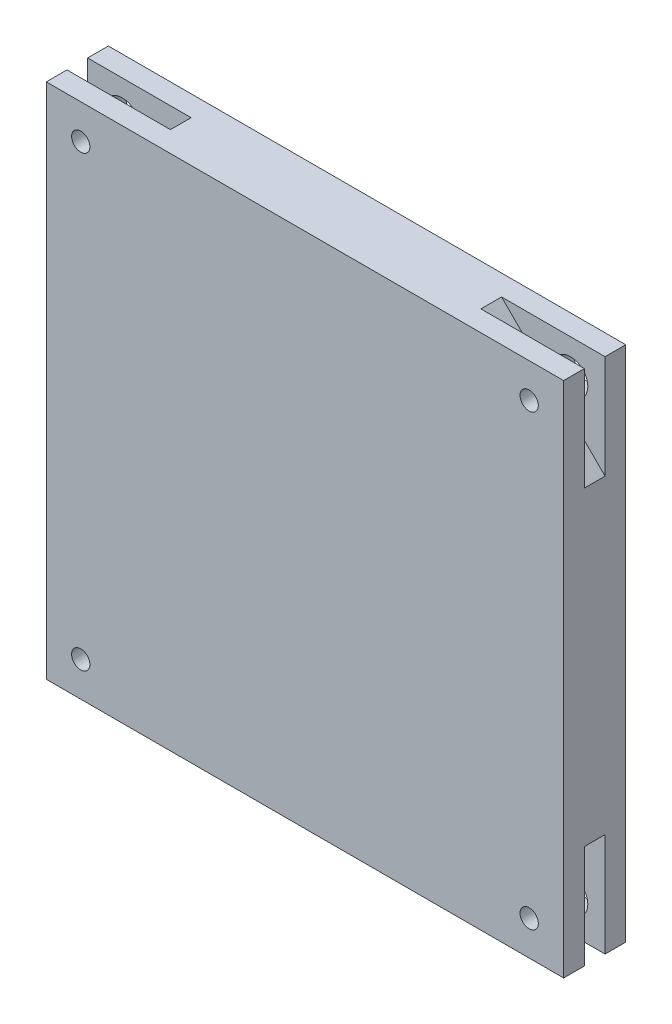
ISO-10303-21;
HEADER;
FILE_DESCRIPTION(('STEP AP214'),'2;1');
FILE_NAME('part.step','',(''),(''),'','','');
FILE_SCHEMA(('AUTOMOTIVE_DESIGN { 1 0 10303 214 1 1 1 1 }'));
ENDSEC;
DATA;
#1=APPLICATION_CONTEXT('core data for automotive mechanical design processes');
#2=APPLICATION_PROTOCOL_DEFINITION('international standard','automotive_design',2000,#1);
#3=PRODUCT_CONTEXT('',#1,'mechanical');
#4=PRODUCT('Part','Part','',(#3));
#5=PRODUCT_RELATED_PRODUCT_CATEGORY('part','',(#4));
#6=PRODUCT_DEFINITION_FORMATION('','',#4);
#7=PRODUCT_DEFINITION_CONTEXT('part definition',#1,'design');
#8=PRODUCT_DEFINITION('design','',#6,#7);
#9=PRODUCT_DEFINITION_SHAPE('','',#8);
#10=(LENGTH_UNIT() NAMED_UNIT(*) SI_UNIT(.MILLI.,.METRE.));
#11=(NAMED_UNIT(*) PLANE_ANGLE_UNIT() SI_UNIT($,.RADIAN.));
#12=(NAMED_UNIT(*) SI_UNIT($,.STERADIAN.) SOLID_ANGLE_UNIT());
#13=UNCERTAINTY_MEASURE_WITH_UNIT(LENGTH_MEASURE(1.E-05),#10,'distance_accuracy_value','');
#14=(GEOMETRIC_REPRESENTATION_CONTEXT(3) GLOBAL_UNCERTAINTY_ASSIGNED_CONTEXT((#13)) GLOBAL_UNIT_ASSIGNED_CONTEXT((#10,
#11,#12)) REPRESENTATION_CONTEXT('',''));
#15=CARTESIAN_POINT('',(0.,0.,0.));
#16=DIRECTION('',(0.,0.,1.));
#17=DIRECTION('',(1.,0.,0.));
#18=AXIS2_PLACEMENT_3D('',#15,#16,#17);
#19=CARTESIAN_POINT('',(-75.,-75.,6.));
#20=DIRECTION('',(0.,0.,1.));
#21=DIRECTION('',(1.,0.,0.));
#22=AXIS2_PLACEMENT_3D('',#19,#20,#21);
#23=PLANE('',#22);
#24=CARTESIAN_POINT('',(65.0000000000001,-65.,6.));
#25=DIRECTION('',(0.,0.,1.));
#26=DIRECTION('',(1.,0.,0.));
#27=AXIS2_PLACEMENT_3D('',#24,#25,#26);
#28=CIRCLE('',#27,5.);
#29=CARTESIAN_POINT('',(70.0000000000001,-65.,6.));
#30=VERTEX_POINT('',#29);
#31=EDGE_CURVE('E387',#30,#30,#28,.T.);
#32=ORIENTED_EDGE('',*,*,#31,.F.);
#33=EDGE_LOOP('',(#32));
#34=FACE_BOUND('',#33,.T.);
#35=DIRECTION('',(0.707106781186548,0.707106781186548,0.));
#36=VECTOR('',#35,1.);
#37=CARTESIAN_POINT('',(44.9999999999999,-75.,6.));
#38=LINE('',#37,#36);
#39=CARTESIAN_POINT('',(45.,-75.,6.));
#40=VERTEX_POINT('',#39);
#41=CARTESIAN_POINT('',(75.0000000000001,-45.,6.));
#42=VERTEX_POINT('',#41);
#43=EDGE_CURVE('E292',#40,#42,#38,.T.);
#44=ORIENTED_EDGE('',*,*,#43,.F.);
#45=DIRECTION('',(1.,0.,0.));
#46=VECTOR('',#45,1.);
#47=CARTESIAN_POINT('',(-75.,-75.,6.));
#48=LINE('',#47,#46);
#49=CARTESIAN_POINT('',(75.0000000000001,-75.,6.));
#50=VERTEX_POINT('',#49);
#51=EDGE_CURVE('E288',#40,#50,#48,.T.);
#52=ORIENTED_EDGE('',*,*,#51,.T.);
#53=DIRECTION('',(0.,1.,0.));
#54=VECTOR('',#53,1.);
#55=CARTESIAN_POINT('',(74.9999999999999,75.,6.));
#56=LINE('',#55,#54);
#57=EDGE_CURVE('E252',#50,#42,#56,.T.);
#58=ORIENTED_EDGE('',*,*,#57,.T.);
#59=EDGE_LOOP('',(#44,#52,#58));
#60=FACE_BOUND('',#59,.T.);
#61=ADVANCED_FACE('F52',(#34,#60),#23,.T.);
#62=CARTESIAN_POINT('',(44.9999999999999,-75.,12.));
#63=DIRECTION('',(-0.707106781186548,0.707106781186548,0.));
#64=DIRECTION('',(0.,0.,1.));
#65=AXIS2_PLACEMENT_3D('',#62,#63,#64);
#66=PLANE('',#65);
#67=ORIENTED_EDGE('',*,*,#43,.T.);
#68=DIRECTION('',(0.,0.,-1.));
#69=VECTOR('',#68,1.);
#70=CARTESIAN_POINT('',(74.9999999999999,-45.,12.));
#71=LINE('',#70,#69);
#72=CARTESIAN_POINT('',(74.9999999999999,-45.,12.));
#73=VERTEX_POINT('',#72);
#74=EDGE_CURVE('E260',#73,#42,#71,.T.);
#75=ORIENTED_EDGE('',*,*,#74,.F.);
#76=DIRECTION('',(0.707106781186548,0.707106781186548,0.));
#77=VECTOR('',#76,1.);
#78=CARTESIAN_POINT('',(44.9999999999999,-75.,12.));
#79=LINE('',#78,#77);
#80=CARTESIAN_POINT('',(44.9999999999999,-75.,12.));
#81=VERTEX_POINT('',#80);
#82=EDGE_CURVE('E251',#81,#73,#79,.T.);
#83=ORIENTED_EDGE('',*,*,#82,.F.);
#84=DIRECTION('',(0.,0.,-1.));
#85=VECTOR('',#84,1.);
#86=CARTESIAN_POINT('',(44.9999999999999,-75.,12.));
#87=LINE('',#86,#85);
#88=EDGE_CURVE('E246',#81,#40,#87,.T.);
#89=ORIENTED_EDGE('',*,*,#88,.T.);
#90=EDGE_LOOP('',(#67,#75,#83,#89));
#91=FACE_BOUND('',#90,.T.);
#92=ADVANCED_FACE('F424',(#91),#66,.F.);
#93=CARTESIAN_POINT('',(-75.,-75.,12.));
#94=DIRECTION('',(0.,0.,1.));
#95=DIRECTION('',(1.,0.,0.));
#96=AXIS2_PLACEMENT_3D('',#93,#94,#95);
#97=PLANE('',#96);
#98=CARTESIAN_POINT('',(65.0000000000001,-65.,12.));
#99=DIRECTION('',(0.,0.,-1.));
#100=DIRECTION('',(-1.,0.,0.));
#101=AXIS2_PLACEMENT_3D('',#98,#99,#100);
#102=CIRCLE('',#101,2.64999999999999);
#103=CARTESIAN_POINT('',(62.3500000000001,-65.,12.));
#104=VERTEX_POINT('',#103);
#105=EDGE_CURVE('E360',#104,#104,#102,.T.);
#106=ORIENTED_EDGE('',*,*,#105,.F.);
#107=EDGE_LOOP('',(#106));
#108=FACE_BOUND('',#107,.T.);
#109=DIRECTION('',(1.,0.,0.));
#110=VECTOR('',#109,1.);
#111=CARTESIAN_POINT('',(-75.,-75.,12.));
#112=LINE('',#111,#110);
#113=CARTESIAN_POINT('',(75.0000000000001,-75.,12.));
#114=VERTEX_POINT('',#113);
#115=EDGE_CURVE('E247',#81,#114,#112,.T.);
#116=ORIENTED_EDGE('',*,*,#115,.F.);
#117=ORIENTED_EDGE('',*,*,#82,.T.);
#118=DIRECTION('',(0.,1.,0.));
#119=VECTOR('',#118,1.);
#120=CARTESIAN_POINT('',(75.0000000000001,75.,12.));
#121=LINE('',#120,#119);
#122=EDGE_CURVE('E306',#114,#73,#121,.T.);
#123=ORIENTED_EDGE('',*,*,#122,.F.);
#124=EDGE_LOOP('',(#116,#117,#123));
#125=FACE_BOUND('',#124,.T.);
#126=ADVANCED_FACE('F435',(#108,#125),#97,.F.);
#127=CARTESIAN_POINT('',(-75.,-75.,12.));
#128=DIRECTION('',(0.,0.,1.));
#129=DIRECTION('',(1.,0.,0.));
#130=AXIS2_PLACEMENT_3D('',#127,#128,#129);
#131=PLANE('',#130);
#132=CARTESIAN_POINT('',(-64.9999999999999,-65.,12.));
#133=DIRECTION('',(0.,0.,-1.));
#134=DIRECTION('',(-1.,0.,0.));
#135=AXIS2_PLACEMENT_3D('',#132,#133,#134);
#136=CIRCLE('',#135,2.64999999999999);
#137=CARTESIAN_POINT('',(-67.6499999999999,-65.,12.));
#138=VERTEX_POINT('',#137);
#139=EDGE_CURVE('E357',#138,#138,#136,.T.);
#140=ORIENTED_EDGE('',*,*,#139,.F.);
#141=EDGE_LOOP('',(#140));
#142=FACE_BOUND('',#141,.T.);
#143=DIRECTION('',(0.,-1.,0.));
#144=VECTOR('',#143,1.);
#145=CARTESIAN_POINT('',(-75.,75.,12.));
#146=LINE('',#145,#144);
#147=CARTESIAN_POINT('',(-75.,-45.,12.));
#148=VERTEX_POINT('',#147);
#149=CARTESIAN_POINT('',(-75.,-75.,12.));
#150=VERTEX_POINT('',#149);
#151=EDGE_CURVE('E322',#148,#150,#146,.T.);
#152=ORIENTED_EDGE('',*,*,#151,.F.);
#153=DIRECTION('',(0.707106781186548,-0.707106781186548,0.));
#154=VECTOR('',#153,1.);
#155=CARTESIAN_POINT('',(-45.,-75.,12.));
#156=LINE('',#155,#154);
#157=CARTESIAN_POINT('',(-45.,-75.,12.));
#158=VERTEX_POINT('',#157);
#159=EDGE_CURVE('E340',#148,#158,#156,.T.);
#160=ORIENTED_EDGE('',*,*,#159,.T.);
#161=DIRECTION('',(1.,0.,0.));
#162=VECTOR('',#161,1.);
#163=CARTESIAN_POINT('',(-75.,-75.,12.));
#164=LINE('',#163,#162);
#165=EDGE_CURVE('E353',#150,#158,#164,.T.);
#166=ORIENTED_EDGE('',*,*,#165,.F.);
#167=EDGE_LOOP('',(#152,#160,#166));
#168=FACE_BOUND('',#167,.T.);
#169=ADVANCED_FACE('F475',(#142,#168),#131,.F.);
#170=CARTESIAN_POINT('',(-45.,-75.,12.));
#171=DIRECTION('',(0.707106781186548,0.707106781186548,0.));
#172=DIRECTION('',(0.,0.,-1.));
#173=AXIS2_PLACEMENT_3D('',#170,#171,#172);
#174=PLANE('',#173);
#175=DIRECTION('',(0.707106781186548,-0.707106781186548,0.));
#176=VECTOR('',#175,1.);
#177=CARTESIAN_POINT('',(-45.,-75.,6.));
#178=LINE('',#177,#176);
#179=CARTESIAN_POINT('',(-75.,-45.,6.));
#180=VERTEX_POINT('',#179);
#181=CARTESIAN_POINT('',(-45.,-75.,6.));
#182=VERTEX_POINT('',#181);
#183=EDGE_CURVE('E277',#180,#182,#178,.T.);
#184=ORIENTED_EDGE('',*,*,#183,.T.);
#185=DIRECTION('',(0.,0.,-1.));
#186=VECTOR('',#185,1.);
#187=CARTESIAN_POINT('',(-45.,-75.,12.));
#188=LINE('',#187,#186);
#189=EDGE_CURVE('E293',#158,#182,#188,.T.);
#190=ORIENTED_EDGE('',*,*,#189,.F.);
#191=ORIENTED_EDGE('',*,*,#159,.F.);
#192=DIRECTION('',(0.,0.,-1.));
#193=VECTOR('',#192,1.);
#194=CARTESIAN_POINT('',(-75.,-45.,12.));
#195=LINE('',#194,#193);
#196=EDGE_CURVE('E234',#148,#180,#195,.T.);
#197=ORIENTED_EDGE('',*,*,#196,.T.);
#198=EDGE_LOOP('',(#184,#190,#191,#197));
#199=FACE_BOUND('',#198,.T.);
#200=ADVANCED_FACE('F477',(#199),#174,.F.);
#201=CARTESIAN_POINT('',(-75.,-75.,6.));
#202=DIRECTION('',(0.,0.,1.));
#203=DIRECTION('',(1.,0.,0.));
#204=AXIS2_PLACEMENT_3D('',#201,#202,#203);
#205=PLANE('',#204);
#206=CARTESIAN_POINT('',(-64.9999999999999,-65.,6.));
#207=DIRECTION('',(0.,0.,1.));
#208=DIRECTION('',(1.,0.,0.));
#209=AXIS2_PLACEMENT_3D('',#206,#207,#208);
#210=CIRCLE('',#209,5.);
#211=CARTESIAN_POINT('',(-59.9999999999999,-65.,6.));
#212=VERTEX_POINT('',#211);
#213=EDGE_CURVE('E393',#212,#212,#210,.T.);
#214=ORIENTED_EDGE('',*,*,#213,.F.);
#215=EDGE_LOOP('',(#214));
#216=FACE_BOUND('',#215,.T.);
#217=ORIENTED_EDGE('',*,*,#183,.F.);
#218=DIRECTION('',(0.,-1.,0.));
#219=VECTOR('',#218,1.);
#220=CARTESIAN_POINT('',(-75.,75.,6.));
#221=LINE('',#220,#219);
#222=CARTESIAN_POINT('',(-75.,-75.,6.));
#223=VERTEX_POINT('',#222);
#224=EDGE_CURVE('E281',#180,#223,#221,.T.);
#225=ORIENTED_EDGE('',*,*,#224,.T.);
#226=DIRECTION('',(1.,0.,0.));
#227=VECTOR('',#226,1.);
#228=CARTESIAN_POINT('',(-75.,-75.,6.));
#229=LINE('',#228,#227);
#230=EDGE_CURVE('E285',#223,#182,#229,.T.);
#231=ORIENTED_EDGE('',*,*,#230,.T.);
#232=EDGE_LOOP('',(#217,#225,#231));
#233=FACE_BOUND('',#232,.T.);
#234=ADVANCED_FACE('F483',(#216,#233),#205,.T.);
#235=CARTESIAN_POINT('',(44.9999999999999,75.,12.));
#236=DIRECTION('',(-0.707106781186548,-0.707106781186548,0.));
#237=DIRECTION('',(-0.707106781186548,0.707106781186548,0.));
#238=AXIS2_PLACEMENT_3D('',#235,#236,#237);
#239=PLANE('',#238);
#240=DIRECTION('',(-0.707106781186548,0.707106781186548,0.));
#241=VECTOR('',#240,1.);
#242=CARTESIAN_POINT('',(44.9999999999999,75.,6.));
#243=LINE('',#242,#241);
#244=CARTESIAN_POINT('',(74.9999999999999,45.,6.));
#245=VERTEX_POINT('',#244);
#246=CARTESIAN_POINT('',(44.9999999999999,75.,6.));
#247=VERTEX_POINT('',#246);
#248=EDGE_CURVE('E243',#245,#247,#243,.T.);
#249=ORIENTED_EDGE('',*,*,#248,.T.);
#250=DIRECTION('',(0.,0.,-1.));
#251=VECTOR('',#250,1.);
#252=CARTESIAN_POINT('',(44.9999999999999,75.,12.));
#253=LINE('',#252,#251);
#254=CARTESIAN_POINT('',(44.9999999999999,75.,12.));
#255=VERTEX_POINT('',#254);
#256=EDGE_CURVE('E11',#255,#247,#253,.T.);
#257=ORIENTED_EDGE('',*,*,#256,.F.);
#258=DIRECTION('',(-0.707106781186548,0.707106781186548,0.));
#259=VECTOR('',#258,1.);
#260=CARTESIAN_POINT('',(44.9999999999999,75.,12.));
#261=LINE('',#260,#259);
#262=CARTESIAN_POINT('',(74.9999999999999,45.,12.));
#263=VERTEX_POINT('',#262);
#264=EDGE_CURVE('E267',#263,#255,#261,.T.);
#265=ORIENTED_EDGE('',*,*,#264,.F.);
#266=DIRECTION('',(0.,0.,-1.));
#267=VECTOR('',#266,1.);
#268=CARTESIAN_POINT('',(74.9999999999999,45.,12.));
#269=LINE('',#268,#267);
#270=EDGE_CURVE('E296',#263,#245,#269,.T.);
#271=ORIENTED_EDGE('',*,*,#270,.T.);
#272=EDGE_LOOP('',(#249,#257,#265,#271));
#273=FACE_BOUND('',#272,.T.);
#274=ADVANCED_FACE('F452',(#273),#239,.F.);
#275=CARTESIAN_POINT('',(-45.,75.,12.));
#276=DIRECTION('',(0.707106781186548,-0.707106781186548,0.));
#277=DIRECTION('',(0.,0.,-1.));
#278=AXIS2_PLACEMENT_3D('',#275,#276,#277);
#279=PLANE('',#278);
#280=DIRECTION('',(-0.707106781186548,-0.707106781186548,0.));
#281=VECTOR('',#280,1.);
#282=CARTESIAN_POINT('',(-45.,75.,6.));
#283=LINE('',#282,#281);
#284=CARTESIAN_POINT('',(-45.,75.,6.));
#285=VERTEX_POINT('',#284);
#286=CARTESIAN_POINT('',(-75.,45.,6.));
#287=VERTEX_POINT('',#286);
#288=EDGE_CURVE('E207',#285,#287,#283,.T.);
#289=ORIENTED_EDGE('',*,*,#288,.T.);
#290=DIRECTION('',(0.,0.,-1.));
#291=VECTOR('',#290,1.);
#292=CARTESIAN_POINT('',(-75.,45.,12.));
#293=LINE('',#292,#291);
#294=CARTESIAN_POINT('',(-75.,45.,12.));
#295=VERTEX_POINT('',#294);
#296=EDGE_CURVE('E202',#295,#287,#293,.T.);
#297=ORIENTED_EDGE('',*,*,#296,.F.);
#298=DIRECTION('',(-0.707106781186548,-0.707106781186548,0.));
#299=VECTOR('',#298,1.);
#300=CARTESIAN_POINT('',(-45.,75.,12.));
#301=LINE('',#300,#299);
#302=CARTESIAN_POINT('',(-45.,75.,12.));
#303=VERTEX_POINT('',#302);
#304=EDGE_CURVE('E205',#303,#295,#301,.T.);
#305=ORIENTED_EDGE('',*,*,#304,.F.);
#306=DIRECTION('',(0.,0.,-1.));
#307=VECTOR('',#306,1.);
#308=CARTESIAN_POINT('',(-45.,75.,12.));
#309=LINE('',#308,#307);
#310=EDGE_CURVE('E62',#303,#285,#309,.T.);
#311=ORIENTED_EDGE('',*,*,#310,.T.);
#312=EDGE_LOOP('',(#289,#297,#305,#311));
#313=FACE_BOUND('',#312,.T.);
#314=ADVANCED_FACE('F204',(#313),#279,.F.);
#315=CARTESIAN_POINT('',(-64.9999999999999,65.,12.));
#316=DIRECTION('',(0.,0.,-1.));
#317=DIRECTION('',(-1.,0.,0.));
#318=AXIS2_PLACEMENT_3D('',#315,#316,#317);
#319=CYLINDRICAL_SURFACE('',#318,2.64999999999999);
#320=CARTESIAN_POINT('',(-64.9999999999999,65.,18.));
#321=DIRECTION('',(0.,0.,1.));
#322=DIRECTION('',(1.,0.,0.));
#323=AXIS2_PLACEMENT_3D('',#320,#321,#322);
#324=CIRCLE('',#323,2.64999999999999);
#325=CARTESIAN_POINT('',(-62.3499999999999,65.,18.));
#326=VERTEX_POINT('',#325);
#327=EDGE_CURVE('E375',#326,#326,#324,.T.);
#328=ORIENTED_EDGE('',*,*,#327,.T.);
#329=EDGE_LOOP('',(#328));
#330=FACE_BOUND('',#329,.T.);
#331=CARTESIAN_POINT('',(-64.9999999999999,65.,12.));
#332=DIRECTION('',(0.,0.,-1.));
#333=DIRECTION('',(-1.,0.,0.));
#334=AXIS2_PLACEMENT_3D('',#331,#332,#333);
#335=CIRCLE('',#334,2.64999999999999);
#336=CARTESIAN_POINT('',(-67.6499999999999,65.,12.));
#337=VERTEX_POINT('',#336);
#338=EDGE_CURVE('E356',#337,#337,#335,.T.);
#339=ORIENTED_EDGE('',*,*,#338,.T.);
#340=EDGE_LOOP('',(#339));
#341=FACE_BOUND('',#340,.T.);
#342=ADVANCED_FACE('F474',(#330,#341),#319,.F.);
#343=CARTESIAN_POINT('',(65.0000000000001,65.,12.));
#344=DIRECTION('',(0.,0.,-1.));
#345=DIRECTION('',(-1.,0.,0.));
#346=AXIS2_PLACEMENT_3D('',#343,#344,#345);
#347=CYLINDRICAL_SURFACE('',#346,2.64999999999999);
#348=CARTESIAN_POINT('',(65.0000000000001,65.,18.));
#349=DIRECTION('',(0.,0.,1.));
#350=DIRECTION('',(1.,0.,0.));
#351=AXIS2_PLACEMENT_3D('',#348,#349,#350);
#352=CIRCLE('',#351,2.64999999999999);
#353=CARTESIAN_POINT('',(67.6500000000001,65.,18.));
#354=VERTEX_POINT('',#353);
#355=EDGE_CURVE('E56',#354,#354,#352,.T.);
#356=ORIENTED_EDGE('',*,*,#355,.T.);
#357=EDGE_LOOP('',(#356));
#358=FACE_BOUND('',#357,.T.);
#359=CARTESIAN_POINT('',(65.0000000000001,65.,12.));
#360=DIRECTION('',(0.,0.,-1.));
#361=DIRECTION('',(-1.,0.,0.));
#362=AXIS2_PLACEMENT_3D('',#359,#360,#361);
#363=CIRCLE('',#362,2.64999999999999);
#364=CARTESIAN_POINT('',(62.3500000000001,65.,12.));
#365=VERTEX_POINT('',#364);
#366=EDGE_CURVE('E370',#365,#365,#363,.T.);
#367=ORIENTED_EDGE('',*,*,#366,.T.);
#368=EDGE_LOOP('',(#367));
#369=FACE_BOUND('',#368,.T.);
#370=ADVANCED_FACE('F482',(#358,#369),#347,.F.);
#371=CARTESIAN_POINT('',(-75.,-75.,6.));
#372=DIRECTION('',(0.,1.,0.));
#373=DIRECTION('',(1.,0.,0.));
#374=AXIS2_PLACEMENT_3D('',#371,#372,#373);
#375=PLANE('',#374);
#376=DIRECTION('',(1.,0.,0.));
#377=VECTOR('',#376,1.);
#378=CARTESIAN_POINT('',(-75.,-75.,0.));
#379=LINE('',#378,#377);
#380=CARTESIAN_POINT('',(-75.,-75.,0.));
#381=VERTEX_POINT('',#380);
#382=CARTESIAN_POINT('',(75.0000000000001,-75.,0.));
#383=VERTEX_POINT('',#382);
#384=EDGE_CURVE('E317',#381,#383,#379,.T.);
#385=ORIENTED_EDGE('',*,*,#384,.T.);
#386=DIRECTION('',(0.,0.,-1.));
#387=VECTOR('',#386,1.);
#388=CARTESIAN_POINT('',(75.0000000000001,-75.,6.));
#389=LINE('',#388,#387);
#390=EDGE_CURVE('E212',#50,#383,#389,.T.);
#391=ORIENTED_EDGE('',*,*,#390,.F.);
#392=ORIENTED_EDGE('',*,*,#51,.F.);
#393=ORIENTED_EDGE('',*,*,#88,.F.);
#394=ORIENTED_EDGE('',*,*,#115,.T.);
#395=DIRECTION('',(0.,0.,-1.));
#396=VECTOR('',#395,1.);
#397=CARTESIAN_POINT('',(75.0000000000001,-75.,18.));
#398=LINE('',#397,#396);
#399=CARTESIAN_POINT('',(75.0000000000001,-75.,18.));
#400=VERTEX_POINT('',#399);
#401=EDGE_CURVE('E297',#400,#114,#398,.T.);
#402=ORIENTED_EDGE('',*,*,#401,.F.);
#403=DIRECTION('',(1.,0.,0.));
#404=VECTOR('',#403,1.);
#405=CARTESIAN_POINT('',(-75.,-75.,18.));
#406=LINE('',#405,#404);
#407=CARTESIAN_POINT('',(-75.,-75.,18.));
#408=VERTEX_POINT('',#407);
#409=EDGE_CURVE('E257',#408,#400,#406,.T.);
#410=ORIENTED_EDGE('',*,*,#409,.F.);
#411=DIRECTION('',(0.,0.,-1.));
#412=VECTOR('',#411,1.);
#413=CARTESIAN_POINT('',(-75.,-75.,18.));
#414=LINE('',#413,#412);
#415=EDGE_CURVE('E213',#408,#150,#414,.T.);
#416=ORIENTED_EDGE('',*,*,#415,.T.);
#417=ORIENTED_EDGE('',*,*,#165,.T.);
#418=ORIENTED_EDGE('',*,*,#189,.T.);
#419=ORIENTED_EDGE('',*,*,#230,.F.);
#420=DIRECTION('',(0.,0.,-1.));
#421=VECTOR('',#420,1.);
#422=CARTESIAN_POINT('',(-75.,-75.,6.));
#423=LINE('',#422,#421);
#424=EDGE_CURVE('E237',#223,#381,#423,.T.);
#425=ORIENTED_EDGE('',*,*,#424,.T.);
#426=EDGE_LOOP('',(#385,#391,#392,#393,#394,#402,#410,#416,#417,#418,#419,#425));
#427=FACE_BOUND('',#426,.T.);
#428=ADVANCED_FACE('F437',(#427),#375,.F.);
#429=CARTESIAN_POINT('',(74.9999999999999,75.,6.));
#430=DIRECTION('',(-1.,0.,0.));
#431=DIRECTION('',(0.,1.,0.));
#432=AXIS2_PLACEMENT_3D('',#429,#430,#431);
#433=PLANE('',#432);
#434=DIRECTION('',(0.,1.,0.));
#435=VECTOR('',#434,1.);
#436=CARTESIAN_POINT('',(74.9999999999999,75.,0.));
#437=LINE('',#436,#435);
#438=CARTESIAN_POINT('',(74.9999999999999,75.,0.));
#439=VERTEX_POINT('',#438);
#440=EDGE_CURVE('E313',#383,#439,#437,.T.);
#441=ORIENTED_EDGE('',*,*,#440,.T.);
#442=DIRECTION('',(0.,0.,-1.));
#443=VECTOR('',#442,1.);
#444=CARTESIAN_POINT('',(74.9999999999999,75.,6.));
#445=LINE('',#444,#443);
#446=CARTESIAN_POINT('',(74.9999999999999,75.,6.));
#447=VERTEX_POINT('',#446);
#448=EDGE_CURVE('E272',#447,#439,#445,.T.);
#449=ORIENTED_EDGE('',*,*,#448,.F.);
#450=DIRECTION('',(0.,1.,0.));
#451=VECTOR('',#450,1.);
#452=CARTESIAN_POINT('',(74.9999999999999,75.,6.));
#453=LINE('',#452,#451);
#454=EDGE_CURVE('E238',#245,#447,#453,.T.);
#455=ORIENTED_EDGE('',*,*,#454,.F.);
#456=ORIENTED_EDGE('',*,*,#270,.F.);
#457=DIRECTION('',(0.,1.,0.));
#458=VECTOR('',#457,1.);
#459=CARTESIAN_POINT('',(75.0000000000001,75.,12.));
#460=LINE('',#459,#458);
#461=CARTESIAN_POINT('',(75.0000000000001,75.,12.));
#462=VERTEX_POINT('',#461);
#463=EDGE_CURVE('E270',#263,#462,#460,.T.);
#464=ORIENTED_EDGE('',*,*,#463,.T.);
#465=DIRECTION('',(0.,0.,-1.));
#466=VECTOR('',#465,1.);
#467=CARTESIAN_POINT('',(75.0000000000001,75.,18.));
#468=LINE('',#467,#466);
#469=CARTESIAN_POINT('',(75.0000000000001,75.,18.));
#470=VERTEX_POINT('',#469);
#471=EDGE_CURVE('E326',#470,#462,#468,.T.);
#472=ORIENTED_EDGE('',*,*,#471,.F.);
#473=DIRECTION('',(0.,1.,0.));
#474=VECTOR('',#473,1.);
#475=CARTESIAN_POINT('',(75.0000000000001,75.,18.));
#476=LINE('',#475,#474);
#477=EDGE_CURVE('E253',#400,#470,#476,.T.);
#478=ORIENTED_EDGE('',*,*,#477,.F.);
#479=ORIENTED_EDGE('',*,*,#401,.T.);
#480=ORIENTED_EDGE('',*,*,#122,.T.);
#481=ORIENTED_EDGE('',*,*,#74,.T.);
#482=ORIENTED_EDGE('',*,*,#57,.F.);
#483=ORIENTED_EDGE('',*,*,#390,.T.);
#484=EDGE_LOOP('',(#441,#449,#455,#456,#464,#472,#478,#479,#480,#481,#482,#483));
#485=FACE_BOUND('',#484,.T.);
#486=ADVANCED_FACE('F430',(#485),#433,.F.);
#487=CARTESIAN_POINT('',(-75.,75.,6.));
#488=DIRECTION('',(1.,0.,0.));
#489=DIRECTION('',(0.,1.,0.));
#490=AXIS2_PLACEMENT_3D('',#487,#488,#489);
#491=PLANE('',#490);
#492=DIRECTION('',(0.,-1.,0.));
#493=VECTOR('',#492,1.);
#494=CARTESIAN_POINT('',(-75.,75.,0.));
#495=LINE('',#494,#493);
#496=CARTESIAN_POINT('',(-75.,75.,0.));
#497=VERTEX_POINT('',#496);
#498=EDGE_CURVE('E333',#497,#381,#495,.T.);
#499=ORIENTED_EDGE('',*,*,#498,.T.);
#500=ORIENTED_EDGE('',*,*,#424,.F.);
#501=ORIENTED_EDGE('',*,*,#224,.F.);
#502=ORIENTED_EDGE('',*,*,#196,.F.);
#503=ORIENTED_EDGE('',*,*,#151,.T.);
#504=ORIENTED_EDGE('',*,*,#415,.F.);
#505=DIRECTION('',(0.,-1.,0.));
#506=VECTOR('',#505,1.);
#507=CARTESIAN_POINT('',(-75.,75.,18.));
#508=LINE('',#507,#506);
#509=CARTESIAN_POINT('',(-75.,75.,18.));
#510=VERTEX_POINT('',#509);
#511=EDGE_CURVE('E264',#510,#408,#508,.T.);
#512=ORIENTED_EDGE('',*,*,#511,.F.);
#513=DIRECTION('',(0.,0.,-1.));
#514=VECTOR('',#513,1.);
#515=CARTESIAN_POINT('',(-75.,75.,18.));
#516=LINE('',#515,#514);
#517=CARTESIAN_POINT('',(-75.,75.,12.));
#518=VERTEX_POINT('',#517);
#519=EDGE_CURVE('E220',#510,#518,#516,.T.);
#520=ORIENTED_EDGE('',*,*,#519,.T.);
#521=DIRECTION('',(0.,-1.,0.));
#522=VECTOR('',#521,1.);
#523=CARTESIAN_POINT('',(-75.,75.,12.));
#524=LINE('',#523,#522);
#525=EDGE_CURVE('E215',#518,#295,#524,.T.);
#526=ORIENTED_EDGE('',*,*,#525,.T.);
#527=ORIENTED_EDGE('',*,*,#296,.T.);
#528=DIRECTION('',(0.,-1.,0.));
#529=VECTOR('',#528,1.);
#530=CARTESIAN_POINT('',(-75.,75.,6.));
#531=LINE('',#530,#529);
#532=CARTESIAN_POINT('',(-75.,75.,6.));
#533=VERTEX_POINT('',#532);
#534=EDGE_CURVE('E224',#533,#287,#531,.T.);
#535=ORIENTED_EDGE('',*,*,#534,.F.);
#536=DIRECTION('',(0.,0.,-1.));
#537=VECTOR('',#536,1.);
#538=CARTESIAN_POINT('',(-75.,75.,6.));
#539=LINE('',#538,#537);
#540=EDGE_CURVE('E276',#533,#497,#539,.T.);
#541=ORIENTED_EDGE('',*,*,#540,.T.);
#542=EDGE_LOOP('',(#499,#500,#501,#502,#503,#504,#512,#520,#526,#527,#535,#541));
#543=FACE_BOUND('',#542,.T.);
#544=ADVANCED_FACE('F217',(#543),#491,.F.);
#545=CARTESIAN_POINT('',(-64.9999999999999,65.,0.));
#546=DIRECTION('',(0.,0.,-1.));
#547=DIRECTION('',(-1.,0.,0.));
#548=AXIS2_PLACEMENT_3D('',#545,#546,#547);
#549=CYLINDRICAL_SURFACE('',#548,5.);
#550=CARTESIAN_POINT('',(-64.9999999999999,65.,0.));
#551=DIRECTION('',(0.,0.,-1.));
#552=DIRECTION('',(-1.,0.,0.));
#553=AXIS2_PLACEMENT_3D('',#550,#551,#552);
#554=CIRCLE('',#553,5.);
#555=CARTESIAN_POINT('',(-69.9999999999999,65.,0.));
#556=VERTEX_POINT('',#555);
#557=EDGE_CURVE('E396',#556,#556,#554,.T.);
#558=ORIENTED_EDGE('',*,*,#557,.T.);
#559=EDGE_LOOP('',(#558));
#560=FACE_BOUND('',#559,.T.);
#561=CARTESIAN_POINT('',(-64.9999999999999,65.,6.));
#562=DIRECTION('',(0.,0.,1.));
#563=DIRECTION('',(1.,0.,0.));
#564=AXIS2_PLACEMENT_3D('',#561,#562,#563);
#565=CIRCLE('',#564,5.);
#566=CARTESIAN_POINT('',(-59.9999999999999,65.,6.));
#567=VERTEX_POINT('',#566);
#568=EDGE_CURVE('E336',#567,#567,#565,.T.);
#569=ORIENTED_EDGE('',*,*,#568,.T.);
#570=EDGE_LOOP('',(#569));
#571=FACE_BOUND('',#570,.T.);
#572=ADVANCED_FACE('F817',(#560,#571),#549,.F.);
#573=CARTESIAN_POINT('',(-64.9999999999999,-65.,0.));
#574=DIRECTION('',(0.,0.,-1.));
#575=DIRECTION('',(-1.,0.,0.));
#576=AXIS2_PLACEMENT_3D('',#573,#574,#575);
#577=CYLINDRICAL_SURFACE('',#576,5.);
#578=CARTESIAN_POINT('',(-64.9999999999999,-65.,0.));
#579=DIRECTION('',(0.,0.,-1.));
#580=DIRECTION('',(-1.,0.,0.));
#581=AXIS2_PLACEMENT_3D('',#578,#579,#580);
#582=CIRCLE('',#581,5.);
#583=CARTESIAN_POINT('',(-69.9999999999999,-65.,0.));
#584=VERTEX_POINT('',#583);
#585=EDGE_CURVE('E390',#584,#584,#582,.T.);
#586=ORIENTED_EDGE('',*,*,#585,.T.);
#587=EDGE_LOOP('',(#586));
#588=FACE_BOUND('',#587,.T.);
#589=ORIENTED_EDGE('',*,*,#213,.T.);
#590=EDGE_LOOP('',(#589));
#591=FACE_BOUND('',#590,.T.);
#592=ADVANCED_FACE('F852',(#588,#591),#577,.F.);
#593=CARTESIAN_POINT('',(65.0000000000001,-65.,0.));
#594=DIRECTION('',(0.,0.,-1.));
#595=DIRECTION('',(-1.,0.,0.));
#596=AXIS2_PLACEMENT_3D('',#593,#594,#595);
#597=CYLINDRICAL_SURFACE('',#596,5.);
#598=CARTESIAN_POINT('',(65.0000000000001,-65.,0.));
#599=DIRECTION('',(0.,0.,-1.));
#600=DIRECTION('',(-1.,0.,0.));
#601=AXIS2_PLACEMENT_3D('',#598,#599,#600);
#602=CIRCLE('',#601,5.);
#603=CARTESIAN_POINT('',(60.0000000000001,-65.,0.));
#604=VERTEX_POINT('',#603);
#605=EDGE_CURVE('E384',#604,#604,#602,.T.);
#606=ORIENTED_EDGE('',*,*,#605,.T.);
#607=EDGE_LOOP('',(#606));
#608=FACE_BOUND('',#607,.T.);
#609=ORIENTED_EDGE('',*,*,#31,.T.);
#610=EDGE_LOOP('',(#609));
#611=FACE_BOUND('',#610,.T.);
#612=ADVANCED_FACE('F861',(#608,#611),#597,.F.);
#613=CARTESIAN_POINT('',(65.0000000000001,65.,0.));
#614=DIRECTION('',(0.,0.,-1.));
#615=DIRECTION('',(-1.,0.,0.));
#616=AXIS2_PLACEMENT_3D('',#613,#614,#615);
#617=CYLINDRICAL_SURFACE('',#616,5.);
#618=CARTESIAN_POINT('',(65.0000000000001,65.,0.));
#619=DIRECTION('',(0.,0.,-1.));
#620=DIRECTION('',(-1.,0.,0.));
#621=AXIS2_PLACEMENT_3D('',#618,#619,#620);
#622=CIRCLE('',#621,5.);
#623=CARTESIAN_POINT('',(60.0000000000001,65.,0.));
#624=VERTEX_POINT('',#623);
#625=EDGE_CURVE('E378',#624,#624,#622,.T.);
#626=ORIENTED_EDGE('',*,*,#625,.T.);
#627=EDGE_LOOP('',(#626));
#628=FACE_BOUND('',#627,.T.);
#629=CARTESIAN_POINT('',(65.0000000000001,65.,6.));
#630=DIRECTION('',(0.,0.,1.));
#631=DIRECTION('',(1.,0.,0.));
#632=AXIS2_PLACEMENT_3D('',#629,#630,#631);
#633=CIRCLE('',#632,5.);
#634=CARTESIAN_POINT('',(70.0000000000001,65.,6.));
#635=VERTEX_POINT('',#634);
#636=EDGE_CURVE('E381',#635,#635,#633,.T.);
#637=ORIENTED_EDGE('',*,*,#636,.T.);
#638=EDGE_LOOP('',(#637));
#639=FACE_BOUND('',#638,.T.);
#640=ADVANCED_FACE('F679',(#628,#639),#617,.F.);
#641=CARTESIAN_POINT('',(-75.,-75.,0.));
#642=DIRECTION('',(0.,0.,1.));
#643=DIRECTION('',(1.,0.,0.));
#644=AXIS2_PLACEMENT_3D('',#641,#642,#643);
#645=PLANE('',#644);
#646=ORIENTED_EDGE('',*,*,#625,.F.);
#647=EDGE_LOOP('',(#646));
#648=FACE_BOUND('',#647,.T.);
#649=ORIENTED_EDGE('',*,*,#605,.F.);
#650=EDGE_LOOP('',(#649));
#651=FACE_BOUND('',#650,.T.);
#652=ORIENTED_EDGE('',*,*,#585,.F.);
#653=EDGE_LOOP('',(#652));
#654=FACE_BOUND('',#653,.T.);
#655=ORIENTED_EDGE('',*,*,#557,.F.);
#656=EDGE_LOOP('',(#655));
#657=FACE_BOUND('',#656,.T.);
#658=ORIENTED_EDGE('',*,*,#498,.F.);
#659=DIRECTION('',(-1.,0.,0.));
#660=VECTOR('',#659,1.);
#661=CARTESIAN_POINT('',(-75.,75.,0.));
#662=LINE('',#661,#660);
#663=EDGE_CURVE('E318',#439,#497,#662,.T.);
#664=ORIENTED_EDGE('',*,*,#663,.F.);
#665=ORIENTED_EDGE('',*,*,#440,.F.);
#666=ORIENTED_EDGE('',*,*,#384,.F.);
#667=EDGE_LOOP('',(#658,#664,#665,#666));
#668=FACE_BOUND('',#667,.T.);
#669=ADVANCED_FACE('F444',(#648,#651,#654,#657,#668),#645,.F.);
#670=CARTESIAN_POINT('',(-64.9999999999999,-65.,12.));
#671=DIRECTION('',(0.,0.,-1.));
#672=DIRECTION('',(-1.,0.,0.));
#673=AXIS2_PLACEMENT_3D('',#670,#671,#672);
#674=CYLINDRICAL_SURFACE('',#673,2.64999999999999);
#675=CARTESIAN_POINT('',(-64.9999999999999,-65.,18.));
#676=DIRECTION('',(0.,0.,1.));
#677=DIRECTION('',(1.,0.,0.));
#678=AXIS2_PLACEMENT_3D('',#675,#676,#677);
#679=CIRCLE('',#678,2.64999999999999);
#680=CARTESIAN_POINT('',(-62.3499999999999,-65.,18.));
#681=VERTEX_POINT('',#680);
#682=EDGE_CURVE('E354',#681,#681,#679,.T.);
#683=ORIENTED_EDGE('',*,*,#682,.T.);
#684=EDGE_LOOP('',(#683));
#685=FACE_BOUND('',#684,.T.);
#686=ORIENTED_EDGE('',*,*,#139,.T.);
#687=EDGE_LOOP('',(#686));
#688=FACE_BOUND('',#687,.T.);
#689=ADVANCED_FACE('F678',(#685,#688),#674,.F.);
#690=CARTESIAN_POINT('',(65.0000000000001,-65.,12.));
#691=DIRECTION('',(0.,0.,-1.));
#692=DIRECTION('',(-1.,0.,0.));
#693=AXIS2_PLACEMENT_3D('',#690,#691,#692);
#694=CYLINDRICAL_SURFACE('',#693,2.64999999999999);
#695=CARTESIAN_POINT('',(65.0000000000001,-65.,18.));
#696=DIRECTION('',(0.,0.,1.));
#697=DIRECTION('',(1.,0.,0.));
#698=AXIS2_PLACEMENT_3D('',#695,#696,#697);
#699=CIRCLE('',#698,2.64999999999999);
#700=CARTESIAN_POINT('',(67.6500000000001,-65.,18.));
#701=VERTEX_POINT('',#700);
#702=EDGE_CURVE('E358',#701,#701,#699,.T.);
#703=ORIENTED_EDGE('',*,*,#702,.T.);
#704=EDGE_LOOP('',(#703));
#705=FACE_BOUND('',#704,.T.);
#706=ORIENTED_EDGE('',*,*,#105,.T.);
#707=EDGE_LOOP('',(#706));
#708=FACE_BOUND('',#707,.T.);
#709=ADVANCED_FACE('F497',(#705,#708),#694,.F.);
#710=CARTESIAN_POINT('',(-75.,-75.,18.));
#711=DIRECTION('',(0.,0.,1.));
#712=DIRECTION('',(1.,0.,0.));
#713=AXIS2_PLACEMENT_3D('',#710,#711,#712);
#714=PLANE('',#713);
#715=ORIENTED_EDGE('',*,*,#702,.F.);
#716=EDGE_LOOP('',(#715));
#717=FACE_BOUND('',#716,.T.);
#718=ORIENTED_EDGE('',*,*,#682,.F.);
#719=EDGE_LOOP('',(#718));
#720=FACE_BOUND('',#719,.T.);
#721=DIRECTION('',(-1.,0.,0.));
#722=VECTOR('',#721,1.);
#723=CARTESIAN_POINT('',(-75.,75.,18.));
#724=LINE('',#723,#722);
#725=EDGE_CURVE('E256',#470,#510,#724,.T.);
#726=ORIENTED_EDGE('',*,*,#725,.T.);
#727=ORIENTED_EDGE('',*,*,#511,.T.);
#728=ORIENTED_EDGE('',*,*,#409,.T.);
#729=ORIENTED_EDGE('',*,*,#477,.T.);
#730=EDGE_LOOP('',(#726,#727,#728,#729));
#731=FACE_BOUND('',#730,.T.);
#732=ORIENTED_EDGE('',*,*,#355,.F.);
#733=EDGE_LOOP('',(#732));
#734=FACE_BOUND('',#733,.T.);
#735=ORIENTED_EDGE('',*,*,#327,.F.);
#736=EDGE_LOOP('',(#735));
#737=FACE_BOUND('',#736,.T.);
#738=ADVANCED_FACE('F490',(#717,#720,#731,#734,#737),#714,.T.);
#739=CARTESIAN_POINT('',(-75.,-75.,6.));
#740=DIRECTION('',(0.,0.,1.));
#741=DIRECTION('',(1.,0.,0.));
#742=AXIS2_PLACEMENT_3D('',#739,#740,#741);
#743=PLANE('',#742);
#744=ORIENTED_EDGE('',*,*,#568,.F.);
#745=EDGE_LOOP('',(#744));
#746=FACE_BOUND('',#745,.T.);
#747=ORIENTED_EDGE('',*,*,#288,.F.);
#748=DIRECTION('',(-1.,0.,0.));
#749=VECTOR('',#748,1.);
#750=CARTESIAN_POINT('',(-75.,75.,6.));
#751=LINE('',#750,#749);
#752=EDGE_CURVE('E229',#285,#533,#751,.T.);
#753=ORIENTED_EDGE('',*,*,#752,.T.);
#754=ORIENTED_EDGE('',*,*,#534,.T.);
#755=EDGE_LOOP('',(#747,#753,#754));
#756=FACE_BOUND('',#755,.T.);
#757=ADVANCED_FACE('F488',(#746,#756),#743,.T.);
#758=CARTESIAN_POINT('',(-75.,-75.,12.));
#759=DIRECTION('',(0.,0.,1.));
#760=DIRECTION('',(1.,0.,0.));
#761=AXIS2_PLACEMENT_3D('',#758,#759,#760);
#762=PLANE('',#761);
#763=ORIENTED_EDGE('',*,*,#338,.F.);
#764=EDGE_LOOP('',(#763));
#765=FACE_BOUND('',#764,.T.);
#766=DIRECTION('',(-1.,0.,0.));
#767=VECTOR('',#766,1.);
#768=CARTESIAN_POINT('',(-75.,75.,12.));
#769=LINE('',#768,#767);
#770=EDGE_CURVE('E70',#303,#518,#769,.T.);
#771=ORIENTED_EDGE('',*,*,#770,.F.);
#772=ORIENTED_EDGE('',*,*,#304,.T.);
#773=ORIENTED_EDGE('',*,*,#525,.F.);
#774=EDGE_LOOP('',(#771,#772,#773));
#775=FACE_BOUND('',#774,.T.);
#776=ADVANCED_FACE('F54',(#765,#775),#762,.F.);
#777=CARTESIAN_POINT('',(-75.,-75.,6.));
#778=DIRECTION('',(0.,0.,1.));
#779=DIRECTION('',(1.,0.,0.));
#780=AXIS2_PLACEMENT_3D('',#777,#778,#779);
#781=PLANE('',#780);
#782=ORIENTED_EDGE('',*,*,#636,.F.);
#783=EDGE_LOOP('',(#782));
#784=FACE_BOUND('',#783,.T.);
#785=ORIENTED_EDGE('',*,*,#248,.F.);
#786=ORIENTED_EDGE('',*,*,#454,.T.);
#787=DIRECTION('',(-1.,0.,0.));
#788=VECTOR('',#787,1.);
#789=CARTESIAN_POINT('',(-75.,75.,6.));
#790=LINE('',#789,#788);
#791=EDGE_CURVE('E242',#447,#247,#790,.T.);
#792=ORIENTED_EDGE('',*,*,#791,.T.);
#793=EDGE_LOOP('',(#785,#786,#792));
#794=FACE_BOUND('',#793,.T.);
#795=ADVANCED_FACE('F450',(#784,#794),#781,.T.);
#796=CARTESIAN_POINT('',(-75.,-75.,12.));
#797=DIRECTION('',(0.,0.,1.));
#798=DIRECTION('',(1.,0.,0.));
#799=AXIS2_PLACEMENT_3D('',#796,#797,#798);
#800=PLANE('',#799);
#801=ORIENTED_EDGE('',*,*,#366,.F.);
#802=EDGE_LOOP('',(#801));
#803=FACE_BOUND('',#802,.T.);
#804=ORIENTED_EDGE('',*,*,#463,.F.);
#805=ORIENTED_EDGE('',*,*,#264,.T.);
#806=DIRECTION('',(-1.,0.,0.));
#807=VECTOR('',#806,1.);
#808=CARTESIAN_POINT('',(-75.,75.,12.));
#809=LINE('',#808,#807);
#810=EDGE_CURVE('E77',#462,#255,#809,.T.);
#811=ORIENTED_EDGE('',*,*,#810,.F.);
#812=EDGE_LOOP('',(#804,#805,#811));
#813=FACE_BOUND('',#812,.T.);
#814=ADVANCED_FACE('F458',(#803,#813),#800,.F.);
#815=CARTESIAN_POINT('',(-75.,75.,6.));
#816=DIRECTION('',(0.,-1.,0.));
#817=DIRECTION('',(0.,0.,-1.));
#818=AXIS2_PLACEMENT_3D('',#815,#816,#817);
#819=PLANE('',#818);
#820=ORIENTED_EDGE('',*,*,#810,.T.);
#821=ORIENTED_EDGE('',*,*,#256,.T.);
#822=ORIENTED_EDGE('',*,*,#791,.F.);
#823=ORIENTED_EDGE('',*,*,#448,.T.);
#824=ORIENTED_EDGE('',*,*,#663,.T.);
#825=ORIENTED_EDGE('',*,*,#540,.F.);
#826=ORIENTED_EDGE('',*,*,#752,.F.);
#827=ORIENTED_EDGE('',*,*,#310,.F.);
#828=ORIENTED_EDGE('',*,*,#770,.T.);
#829=ORIENTED_EDGE('',*,*,#519,.F.);
#830=ORIENTED_EDGE('',*,*,#725,.F.);
#831=ORIENTED_EDGE('',*,*,#471,.T.);
#832=EDGE_LOOP('',(#820,#821,#822,#823,#824,#825,#826,#827,#828,#829,#830,#831));
#833=FACE_BOUND('',#832,.T.);
#834=ADVANCED_FACE('F448',(#833),#819,.F.);
#835=CLOSED_SHELL('',(#61,#92,#126,#169,#200,#234,#274,#314,#342,#370,#428,#486,#544,#572,#592,
#612,#640,#669,#689,#709,#738,#757,#776,#795,#814,#834));
#836=MANIFOLD_SOLID_BREP('B2',#835);
#837=ADVANCED_BREP_SHAPE_REPRESENTATION('',(#18,#836),#14);
#838=SHAPE_DEFINITION_REPRESENTATION(#9,#837);
ENDSEC;
END-ISO-10303-21;
